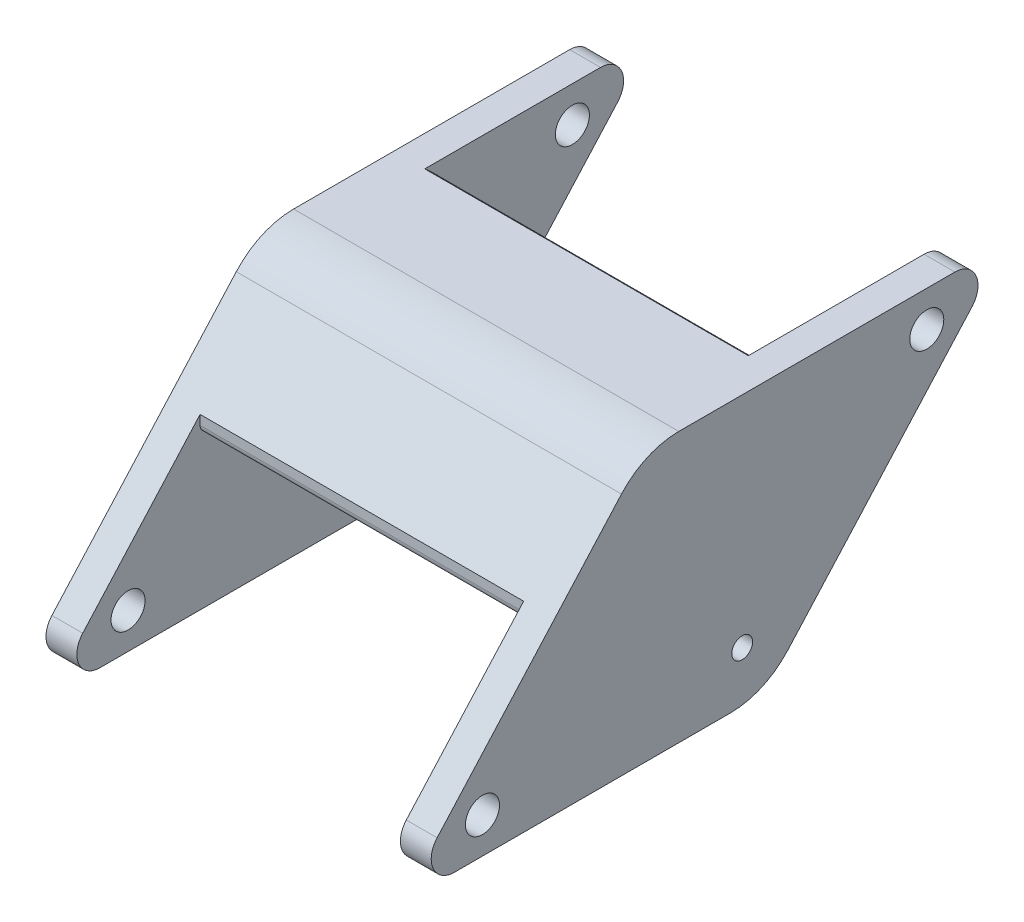
ISO-10303-21;
HEADER;
FILE_DESCRIPTION(('STEP AP214'),'2;1');
FILE_NAME('part.step','',(''),(''),'','','');
FILE_SCHEMA(('AUTOMOTIVE_DESIGN { 1 0 10303 214 1 1 1 1 }'));
ENDSEC;
DATA;
#1=APPLICATION_CONTEXT('core data for automotive mechanical design processes');
#2=APPLICATION_PROTOCOL_DEFINITION('international standard','automotive_design',2000,#1);
#3=PRODUCT_CONTEXT('',#1,'mechanical');
#4=PRODUCT('Part','Part','',(#3));
#5=PRODUCT_RELATED_PRODUCT_CATEGORY('part','',(#4));
#6=PRODUCT_DEFINITION_FORMATION('','',#4);
#7=PRODUCT_DEFINITION_CONTEXT('part definition',#1,'design');
#8=PRODUCT_DEFINITION('design','',#6,#7);
#9=PRODUCT_DEFINITION_SHAPE('','',#8);
#10=(LENGTH_UNIT() NAMED_UNIT(*) SI_UNIT(.MILLI.,.METRE.));
#11=(NAMED_UNIT(*) PLANE_ANGLE_UNIT() SI_UNIT($,.RADIAN.));
#12=(NAMED_UNIT(*) SI_UNIT($,.STERADIAN.) SOLID_ANGLE_UNIT());
#13=UNCERTAINTY_MEASURE_WITH_UNIT(LENGTH_MEASURE(1.E-05),#10,'distance_accuracy_value','');
#14=(GEOMETRIC_REPRESENTATION_CONTEXT(3) GLOBAL_UNCERTAINTY_ASSIGNED_CONTEXT((#13)) GLOBAL_UNIT_ASSIGNED_CONTEXT((#10,
#11,#12)) REPRESENTATION_CONTEXT('',''));
#15=CARTESIAN_POINT('',(0.,0.,0.));
#16=DIRECTION('',(0.,0.,1.));
#17=DIRECTION('',(1.,0.,0.));
#18=AXIS2_PLACEMENT_3D('',#15,#16,#17);
#19=CARTESIAN_POINT('',(4.,11.5468785027384,-24.0553453618104));
#20=DIRECTION('',(0.,0.66777921611463,0.744359401448877));
#21=DIRECTION('',(0.,-0.744359401448877,0.66777921611463));
#22=AXIS2_PLACEMENT_3D('',#19,#20,#21);
#23=PLANE('',#22);
#24=DIRECTION('',(0.,0.744359401448877,-0.66777921611463));
#25=VECTOR('',#24,1.);
#26=CARTESIAN_POINT('',(46.,-6.80804717172648,-7.58878652628227));
#27=LINE('',#26,#25);
#28=CARTESIAN_POINT('',(46.,-15.127576010064,-0.125176292712019));
#29=VERTEX_POINT('',#28);
#30=CARTESIAN_POINT('',(46.,11.5468785027384,-24.0553453618104));
#31=VERTEX_POINT('',#30);
#32=EDGE_CURVE('E256',#29,#31,#27,.T.);
#33=ORIENTED_EDGE('',*,*,#32,.T.);
#34=DIRECTION('',(-1.,0.,0.));
#35=VECTOR('',#34,1.);
#36=CARTESIAN_POINT('',(4.,11.5468785027384,-24.0553453618104));
#37=LINE('',#36,#35);
#38=CARTESIAN_POINT('',(50.,11.5468785027384,-24.0553453618104));
#39=VERTEX_POINT('',#38);
#40=EDGE_CURVE('E323',#39,#31,#37,.T.);
#41=ORIENTED_EDGE('',*,*,#40,.F.);
#42=DIRECTION('',(0.,0.744359401448877,-0.66777921611463));
#43=VECTOR('',#42,1.);
#44=CARTESIAN_POINT('',(50.,-6.80804717172648,-7.58878652628227));
#45=LINE('',#44,#43);
#46=CARTESIAN_POINT('',(50.,-15.127576010064,-0.125176292712019));
#47=VERTEX_POINT('',#46);
#48=EDGE_CURVE('E231',#47,#39,#45,.T.);
#49=ORIENTED_EDGE('',*,*,#48,.F.);
#50=DIRECTION('',(-1.,0.,0.));
#51=VECTOR('',#50,1.);
#52=CARTESIAN_POINT('',(50.,-15.127576010064,-0.125176292712019));
#53=LINE('',#52,#51);
#54=EDGE_CURVE('E261',#47,#29,#53,.T.);
#55=ORIENTED_EDGE('',*,*,#54,.T.);
#56=EDGE_LOOP('',(#33,#41,#49,#55));
#57=FACE_BOUND('',#56,.T.);
#58=ADVANCED_FACE('F35',(#57),#23,.F.);
#59=CARTESIAN_POINT('',(4.,13.5502161510823,-21.8222671574638));
#60=DIRECTION('',(-1.,0.,0.));
#61=DIRECTION('',(0.,0.,1.));
#62=AXIS2_PLACEMENT_3D('',#59,#60,#61);
#63=CYLINDRICAL_SURFACE('',#62,3.);
#64=CARTESIAN_POINT('',(46.,13.5502161510823,-21.8222671574638));
#65=DIRECTION('',(-1.,0.,0.));
#66=DIRECTION('',(0.,0.,1.));
#67=AXIS2_PLACEMENT_3D('',#64,#65,#66);
#68=CIRCLE('',#67,3.);
#69=CARTESIAN_POINT('',(46.,16.5502161510823,-21.8222671574638));
#70=VERTEX_POINT('',#69);
#71=EDGE_CURVE('E187',#70,#31,#68,.T.);
#72=ORIENTED_EDGE('',*,*,#71,.F.);
#73=DIRECTION('',(-1.,0.,0.));
#74=VECTOR('',#73,1.);
#75=CARTESIAN_POINT('',(4.,16.5502161510823,-21.8222671574638));
#76=LINE('',#75,#74);
#77=CARTESIAN_POINT('',(50.,16.5502161510823,-21.8222671574638));
#78=VERTEX_POINT('',#77);
#79=EDGE_CURVE('E320',#78,#70,#76,.T.);
#80=ORIENTED_EDGE('',*,*,#79,.F.);
#81=CARTESIAN_POINT('',(50.,13.5502161510823,-21.8222671574638));
#82=DIRECTION('',(1.,0.,0.));
#83=DIRECTION('',(0.,0.,-1.));
#84=AXIS2_PLACEMENT_3D('',#81,#82,#83);
#85=CIRCLE('',#84,3.);
#86=EDGE_CURVE('E235',#39,#78,#85,.T.);
#87=ORIENTED_EDGE('',*,*,#86,.F.);
#88=ORIENTED_EDGE('',*,*,#40,.T.);
#89=EDGE_LOOP('',(#72,#80,#87,#88));
#90=FACE_BOUND('',#89,.T.);
#91=ADVANCED_FACE('F371',(#90),#63,.T.);
#92=CARTESIAN_POINT('',(4.,-15.4497838489177,43.1538682593548));
#93=DIRECTION('',(-1.,0.,0.));
#94=DIRECTION('',(0.,0.,1.));
#95=AXIS2_PLACEMENT_3D('',#92,#93,#94);
#96=CYLINDRICAL_SURFACE('',#95,3.);
#97=CARTESIAN_POINT('',(46.,-15.4497838489177,43.1538682593548));
#98=DIRECTION('',(1.,0.,0.));
#99=DIRECTION('',(0.,0.,-1.));
#100=AXIS2_PLACEMENT_3D('',#97,#98,#99);
#101=CIRCLE('',#100,3.);
#102=CARTESIAN_POINT('',(46.,-13.4464462005738,45.3869464637014));
#103=VERTEX_POINT('',#102);
#104=CARTESIAN_POINT('',(46.,-18.4497838489177,43.1538682593548));
#105=VERTEX_POINT('',#104);
#106=EDGE_CURVE('E203',#103,#105,#101,.T.);
#107=ORIENTED_EDGE('',*,*,#106,.T.);
#108=DIRECTION('',(-1.,0.,0.));
#109=VECTOR('',#108,1.);
#110=CARTESIAN_POINT('',(4.,-18.4497838489177,43.1538682593548));
#111=LINE('',#110,#109);
#112=CARTESIAN_POINT('',(50.,-18.4497838489177,43.1538682593548));
#113=VERTEX_POINT('',#112);
#114=EDGE_CURVE('E306',#113,#105,#111,.T.);
#115=ORIENTED_EDGE('',*,*,#114,.F.);
#116=CARTESIAN_POINT('',(50.,-15.4497838489177,43.1538682593548));
#117=DIRECTION('',(1.,0.,0.));
#118=DIRECTION('',(0.,0.,-1.));
#119=AXIS2_PLACEMENT_3D('',#116,#117,#118);
#120=CIRCLE('',#119,3.);
#121=CARTESIAN_POINT('',(50.,-13.4464462005738,45.3869464637014));
#122=VERTEX_POINT('',#121);
#123=EDGE_CURVE('E247',#122,#113,#120,.T.);
#124=ORIENTED_EDGE('',*,*,#123,.F.);
#125=DIRECTION('',(-1.,0.,0.));
#126=VECTOR('',#125,1.);
#127=CARTESIAN_POINT('',(4.,-13.4464462005738,45.3869464637014));
#128=LINE('',#127,#126);
#129=EDGE_CURVE('E310',#122,#103,#128,.T.);
#130=ORIENTED_EDGE('',*,*,#129,.T.);
#131=EDGE_LOOP('',(#107,#115,#124,#130));
#132=FACE_BOUND('',#131,.T.);
#133=ADVANCED_FACE('F378',(#132),#96,.T.);
#134=CARTESIAN_POINT('',(4.,-18.4497838489177,43.1538682593548));
#135=DIRECTION('',(0.,1.,0.));
#136=DIRECTION('',(0.,0.,1.));
#137=AXIS2_PLACEMENT_3D('',#134,#135,#136);
#138=PLANE('',#137);
#139=DIRECTION('',(0.,0.,-1.));
#140=VECTOR('',#139,1.);
#141=CARTESIAN_POINT('',(4.,-18.4497838489177,43.1538682593548));
#142=LINE('',#141,#140);
#143=CARTESIAN_POINT('',(4.00000000000001,-18.4497838489177,43.1538682593548));
#144=VERTEX_POINT('',#143);
#145=CARTESIAN_POINT('',(4.,-18.4497838489177,7.31841772177682));
#146=VERTEX_POINT('',#145);
#147=EDGE_CURVE('E281',#144,#146,#142,.T.);
#148=ORIENTED_EDGE('',*,*,#147,.F.);
#149=CARTESIAN_POINT('',(0.,-18.4497838489177,43.1538682593548));
#150=VERTEX_POINT('',#149);
#151=EDGE_CURVE('E305',#144,#150,#111,.T.);
#152=ORIENTED_EDGE('',*,*,#151,.T.);
#153=DIRECTION('',(0.,0.,-1.));
#154=VECTOR('',#153,1.);
#155=CARTESIAN_POINT('',(0.,-18.4497838489177,43.1538682593548));
#156=LINE('',#155,#154);
#157=CARTESIAN_POINT('',(0.,-18.4497838489177,7.31841772177682));
#158=VERTEX_POINT('',#157);
#159=EDGE_CURVE('E279',#150,#158,#156,.T.);
#160=ORIENTED_EDGE('',*,*,#159,.T.);
#161=DIRECTION('',(-1.,0.,0.));
#162=VECTOR('',#161,1.);
#163=CARTESIAN_POINT('',(4.,-18.4497838489177,7.31841772177682));
#164=LINE('',#163,#162);
#165=EDGE_CURVE('E283',#146,#158,#164,.T.);
#166=ORIENTED_EDGE('',*,*,#165,.F.);
#167=EDGE_LOOP('',(#148,#152,#160,#166));
#168=FACE_BOUND('',#167,.T.);
#169=ADVANCED_FACE('F428',(#168),#138,.F.);
#170=CARTESIAN_POINT('',(46.,0.,0.));
#171=DIRECTION('',(1.,0.,0.));
#172=DIRECTION('',(0.,0.,-1.));
#173=AXIS2_PLACEMENT_3D('',#170,#171,#172);
#174=PLANE('',#173);
#175=CARTESIAN_POINT('',(46.,-13.8195181432474,39.5011660091139));
#176=DIRECTION('',(1.,0.,0.));
#177=DIRECTION('',(0.,0.,-1.));
#178=AXIS2_PLACEMENT_3D('',#175,#176,#177);
#179=CIRCLE('',#178,2.21);
#180=CARTESIAN_POINT('',(46.,-13.8195181432474,37.2911660091139));
#181=VERTEX_POINT('',#180);
#182=EDGE_CURVE('E177',#181,#181,#179,.T.);
#183=ORIENTED_EDGE('',*,*,#182,.T.);
#184=EDGE_LOOP('',(#183));
#185=FACE_BOUND('',#184,.T.);
#186=CARTESIAN_POINT('',(46.,11.9199504454126,-18.1695649072226));
#187=DIRECTION('',(1.,0.,0.));
#188=DIRECTION('',(0.,0.,-1.));
#189=AXIS2_PLACEMENT_3D('',#186,#187,#188);
#190=CIRCLE('',#189,2.21);
#191=CARTESIAN_POINT('',(46.,11.9199504454126,-20.3795649072226));
#192=VERTEX_POINT('',#191);
#193=EDGE_CURVE('E510',#192,#192,#190,.T.);
#194=ORIENTED_EDGE('',*,*,#193,.T.);
#195=EDGE_LOOP('',(#194));
#196=FACE_BOUND('',#195,.T.);
#197=DIRECTION('',(0.,1.,0.));
#198=VECTOR('',#197,1.);
#199=CARTESIAN_POINT('',(46.,-18.4497838489177,30.1538682593548));
#200=LINE('',#199,#198);
#201=CARTESIAN_POINT('',(46.,2.29949484999777,30.1538682593548));
#202=VERTEX_POINT('',#201);
#203=CARTESIAN_POINT('',(46.,3.53354464188598,30.1538682593548));
#204=VERTEX_POINT('',#203);
#205=EDGE_CURVE('E200',#202,#204,#200,.T.);
#206=ORIENTED_EDGE('',*,*,#205,.F.);
#207=CARTESIAN_POINT('',(46.,2.29949484999777,29.1538682593548));
#208=DIRECTION('',(1.,0.,0.));
#209=DIRECTION('',(0.,0.,-1.));
#210=AXIS2_PLACEMENT_3D('',#207,#208,#209);
#211=CIRCLE('',#210,1.);
#212=CARTESIAN_POINT('',(46.,1.7880396434308,28.2945583201155));
#213=VERTEX_POINT('',#212);
#214=EDGE_CURVE('E339',#202,#213,#211,.T.);
#215=ORIENTED_EDGE('',*,*,#214,.T.);
#216=CARTESIAN_POINT('',(46.,-11.5096495734594,5.95274545699105));
#217=DIRECTION('',(-1.,0.,0.));
#218=DIRECTION('',(0.,0.,1.));
#219=AXIS2_PLACEMENT_3D('',#216,#217,#218);
#220=CIRCLE('',#219,25.9997142391964);
#221=CARTESIAN_POINT('',(46.,14.0006093580096,0.931607162811683));
#222=VERTEX_POINT('',#221);
#223=EDGE_CURVE('E264',#213,#222,#220,.T.);
#224=ORIENTED_EDGE('',*,*,#223,.T.);
#225=CARTESIAN_POINT('',(46.,14.9817839469599,0.738484336615015));
#226=DIRECTION('',(1.,0.,0.));
#227=DIRECTION('',(0.,0.,-1.));
#228=AXIS2_PLACEMENT_3D('',#225,#226,#227);
#229=CIRCLE('',#228,1.);
#230=CARTESIAN_POINT('',(46.,15.7261433484088,0.0707051205003743));
#231=VERTEX_POINT('',#230);
#232=EDGE_CURVE('E43',#222,#231,#229,.T.);
#233=ORIENTED_EDGE('',*,*,#232,.T.);
#234=DIRECTION('',(0.,0.66777921611463,0.744359401448877));
#235=VECTOR('',#234,1.);
#236=CARTESIAN_POINT('',(46.,-11.8873898877638,-30.7095177069764));
#237=LINE('',#236,#235);
#238=CARTESIAN_POINT('',(46.,16.5502161510823,0.989281684948384));
#239=VERTEX_POINT('',#238);
#240=EDGE_CURVE('E176',#231,#239,#237,.T.);
#241=ORIENTED_EDGE('',*,*,#240,.T.);
#242=DIRECTION('',(0.,0.,-1.));
#243=VECTOR('',#242,1.);
#244=CARTESIAN_POINT('',(46.,16.5502161510823,14.0131833801142));
#245=LINE('',#244,#243);
#246=EDGE_CURVE('E192',#239,#70,#245,.T.);
#247=ORIENTED_EDGE('',*,*,#246,.T.);
#248=ORIENTED_EDGE('',*,*,#71,.T.);
#249=ORIENTED_EDGE('',*,*,#32,.F.);
#250=CARTESIAN_POINT('',(46.,-8.44978384891769,7.31841772177678));
#251=DIRECTION('',(1.,0.,0.));
#252=DIRECTION('',(0.,0.,-1.));
#253=AXIS2_PLACEMENT_3D('',#250,#251,#252);
#254=CIRCLE('',#253,10.);
#255=CARTESIAN_POINT('',(46.,-18.4497838489177,7.31841772177667));
#256=VERTEX_POINT('',#255);
#257=EDGE_CURVE('E227',#29,#256,#254,.F.);
#258=ORIENTED_EDGE('',*,*,#257,.T.);
#259=DIRECTION('',(0.,0.,1.));
#260=VECTOR('',#259,1.);
#261=CARTESIAN_POINT('',(46.,-18.4497838489177,0.));
#262=LINE('',#261,#260);
#263=EDGE_CURVE('E232',#256,#105,#262,.T.);
#264=ORIENTED_EDGE('',*,*,#263,.T.);
#265=ORIENTED_EDGE('',*,*,#106,.F.);
#266=DIRECTION('',(0.,-0.744359401448877,0.66777921611463));
#267=VECTOR('',#266,1.);
#268=CARTESIAN_POINT('',(46.,13.2280083122286,21.456777394603));
#269=LINE('',#268,#267);
#270=EDGE_CURVE('E206',#204,#103,#269,.T.);
#271=ORIENTED_EDGE('',*,*,#270,.F.);
#272=EDGE_LOOP('',(#206,#215,#224,#233,#241,#247,#248,#249,#258,#264,#265,#271));
#273=FACE_BOUND('',#272,.T.);
#274=CARTESIAN_POINT('',(46.,-11.8749197984836,5.78971888642409));
#275=DIRECTION('',(1.,0.,0.));
#276=DIRECTION('',(0.,0.,-1.));
#277=AXIS2_PLACEMENT_3D('',#274,#275,#276);
#278=CIRCLE('',#277,3.);
#279=CARTESIAN_POINT('',(46.,-11.8749197984836,2.78971888642409));
#280=VERTEX_POINT('',#279);
#281=EDGE_CURVE('E329',#280,#280,#278,.F.);
#282=ORIENTED_EDGE('',*,*,#281,.F.);
#283=EDGE_LOOP('',(#282));
#284=FACE_BOUND('',#283,.T.);
#285=ADVANCED_FACE('F352',(#185,#196,#273,#284),#174,.F.);
#286=CARTESIAN_POINT('',(4.,-8.44978384891769,7.31841772177678));
#287=DIRECTION('',(1.,0.,0.));
#288=DIRECTION('',(0.,0.,-1.));
#289=AXIS2_PLACEMENT_3D('',#286,#287,#288);
#290=PLANE('',#289);
#291=CARTESIAN_POINT('',(4.,-13.8195181432474,39.5011660091139));
#292=DIRECTION('',(1.,0.,0.));
#293=DIRECTION('',(0.,0.,-1.));
#294=AXIS2_PLACEMENT_3D('',#291,#292,#293);
#295=CIRCLE('',#294,2.21);
#296=CARTESIAN_POINT('',(4.,-13.8195181432474,37.2911660091139));
#297=VERTEX_POINT('',#296);
#298=EDGE_CURVE('E513',#297,#297,#295,.T.);
#299=ORIENTED_EDGE('',*,*,#298,.F.);
#300=EDGE_LOOP('',(#299));
#301=FACE_BOUND('',#300,.T.);
#302=CARTESIAN_POINT('',(4.,11.9199504454126,-18.1695649072226));
#303=DIRECTION('',(1.,0.,0.));
#304=DIRECTION('',(0.,0.,-1.));
#305=AXIS2_PLACEMENT_3D('',#302,#303,#304);
#306=CIRCLE('',#305,2.21);
#307=CARTESIAN_POINT('',(4.,11.9199504454126,-20.3795649072226));
#308=VERTEX_POINT('',#307);
#309=EDGE_CURVE('E507',#308,#308,#306,.T.);
#310=ORIENTED_EDGE('',*,*,#309,.F.);
#311=EDGE_LOOP('',(#310));
#312=FACE_BOUND('',#311,.T.);
#313=DIRECTION('',(0.,0.744359401448877,-0.66777921611463));
#314=VECTOR('',#313,1.);
#315=CARTESIAN_POINT('',(4.,11.5468785027384,-24.0553453618104));
#316=LINE('',#315,#314);
#317=CARTESIAN_POINT('',(4.,-15.127576010064,-0.125176292712019));
#318=VERTEX_POINT('',#317);
#319=CARTESIAN_POINT('',(4.,11.5468785027384,-24.0553453618104));
#320=VERTEX_POINT('',#319);
#321=EDGE_CURVE('E278',#318,#320,#316,.T.);
#322=ORIENTED_EDGE('',*,*,#321,.T.);
#323=CARTESIAN_POINT('',(4.,13.5502161510823,-21.8222671574638));
#324=DIRECTION('',(-1.,0.,0.));
#325=DIRECTION('',(0.,-1.,0.));
#326=AXIS2_PLACEMENT_3D('',#323,#324,#325);
#327=CIRCLE('',#326,3.);
#328=CARTESIAN_POINT('',(4.,16.5502161510823,-21.8222671574638));
#329=VERTEX_POINT('',#328);
#330=EDGE_CURVE('E184',#329,#320,#327,.T.);
#331=ORIENTED_EDGE('',*,*,#330,.F.);
#332=DIRECTION('',(0.,0.,-1.));
#333=VECTOR('',#332,1.);
#334=CARTESIAN_POINT('',(4.,16.5502161510823,14.0131833801142));
#335=LINE('',#334,#333);
#336=CARTESIAN_POINT('',(4.,16.5502161510823,0.989281684948384));
#337=VERTEX_POINT('',#336);
#338=EDGE_CURVE('E180',#337,#329,#335,.T.);
#339=ORIENTED_EDGE('',*,*,#338,.F.);
#340=DIRECTION('',(0.,0.66777921611463,0.744359401448877));
#341=VECTOR('',#340,1.);
#342=CARTESIAN_POINT('',(4.,-11.8873898877638,-30.7095177069764));
#343=LINE('',#342,#341);
#344=CARTESIAN_POINT('',(4.,15.7261433484088,0.0707051205003743));
#345=VERTEX_POINT('',#344);
#346=EDGE_CURVE('E168',#345,#337,#343,.T.);
#347=ORIENTED_EDGE('',*,*,#346,.F.);
#348=CARTESIAN_POINT('',(4.,14.9817839469599,0.738484336615015));
#349=DIRECTION('',(1.,0.,0.));
#350=DIRECTION('',(0.,0.,-1.));
#351=AXIS2_PLACEMENT_3D('',#348,#349,#350);
#352=CIRCLE('',#351,1.);
#353=CARTESIAN_POINT('',(4.,14.0006093580096,0.931607162811683));
#354=VERTEX_POINT('',#353);
#355=EDGE_CURVE('E11',#345,#354,#352,.F.);
#356=ORIENTED_EDGE('',*,*,#355,.T.);
#357=CARTESIAN_POINT('',(4.,-11.5096495734594,5.95274545699105));
#358=DIRECTION('',(-1.,0.,0.));
#359=DIRECTION('',(0.,0.,1.));
#360=AXIS2_PLACEMENT_3D('',#357,#358,#359);
#361=CIRCLE('',#360,25.9997142391964);
#362=CARTESIAN_POINT('',(4.,1.7880396434308,28.2945583201155));
#363=VERTEX_POINT('',#362);
#364=EDGE_CURVE('E263',#363,#354,#361,.T.);
#365=ORIENTED_EDGE('',*,*,#364,.F.);
#366=CARTESIAN_POINT('',(4.,2.29949484999777,29.1538682593548));
#367=DIRECTION('',(1.,0.,0.));
#368=DIRECTION('',(0.,0.,-1.));
#369=AXIS2_PLACEMENT_3D('',#366,#367,#368);
#370=CIRCLE('',#369,1.);
#371=CARTESIAN_POINT('',(4.00000000000001,2.29949484999777,30.1538682593548));
#372=VERTEX_POINT('',#371);
#373=EDGE_CURVE('E337',#363,#372,#370,.F.);
#374=ORIENTED_EDGE('',*,*,#373,.T.);
#375=DIRECTION('',(0.,1.,0.));
#376=VECTOR('',#375,1.);
#377=CARTESIAN_POINT('',(4.00000000000001,-18.4497838489177,30.1538682593548));
#378=LINE('',#377,#376);
#379=CARTESIAN_POINT('',(4.00000000000001,3.53354464188597,30.1538682593548));
#380=VERTEX_POINT('',#379);
#381=EDGE_CURVE('E201',#372,#380,#378,.T.);
#382=ORIENTED_EDGE('',*,*,#381,.T.);
#383=DIRECTION('',(0.,0.744359401448877,-0.66777921611463));
#384=VECTOR('',#383,1.);
#385=CARTESIAN_POINT('',(4.,13.2280083122286,21.456777394603));
#386=LINE('',#385,#384);
#387=CARTESIAN_POINT('',(4.00000000000001,-13.4464462005738,45.3869464637014));
#388=VERTEX_POINT('',#387);
#389=EDGE_CURVE('E215',#388,#380,#386,.T.);
#390=ORIENTED_EDGE('',*,*,#389,.F.);
#391=CARTESIAN_POINT('',(4.00000000000001,-15.4497838489177,43.1538682593548));
#392=DIRECTION('',(-1.,0.,0.));
#393=DIRECTION('',(0.,0.,1.));
#394=AXIS2_PLACEMENT_3D('',#391,#392,#393);
#395=CIRCLE('',#394,3.);
#396=EDGE_CURVE('E212',#144,#388,#395,.T.);
#397=ORIENTED_EDGE('',*,*,#396,.F.);
#398=ORIENTED_EDGE('',*,*,#147,.T.);
#399=CARTESIAN_POINT('',(4.,-8.44978384891769,7.31841772177678));
#400=DIRECTION('',(1.,0.,0.));
#401=DIRECTION('',(0.,0.,-1.));
#402=AXIS2_PLACEMENT_3D('',#399,#400,#401);
#403=CIRCLE('',#402,10.);
#404=EDGE_CURVE('E275',#146,#318,#403,.T.);
#405=ORIENTED_EDGE('',*,*,#404,.T.);
#406=EDGE_LOOP('',(#322,#331,#339,#347,#356,#365,#374,#382,#390,#397,#398,#405));
#407=FACE_BOUND('',#406,.T.);
#408=CARTESIAN_POINT('',(4.,-11.5096495734594,5.95274545699105));
#409=DIRECTION('',(1.,0.,0.));
#410=DIRECTION('',(0.,0.,-1.));
#411=AXIS2_PLACEMENT_3D('',#408,#409,#410);
#412=CIRCLE('',#411,3.6);
#413=CARTESIAN_POINT('',(4.,-11.5096495734594,2.35274545699105));
#414=VERTEX_POINT('',#413);
#415=EDGE_CURVE('E269',#414,#414,#412,.T.);
#416=ORIENTED_EDGE('',*,*,#415,.F.);
#417=EDGE_LOOP('',(#416));
#418=FACE_BOUND('',#417,.T.);
#419=ADVANCED_FACE('F181',(#301,#312,#407,#418),#290,.T.);
#420=CARTESIAN_POINT('',(0.,-8.44978384891769,7.31841772177678));
#421=DIRECTION('',(1.,0.,0.));
#422=DIRECTION('',(0.,0.,-1.));
#423=AXIS2_PLACEMENT_3D('',#420,#421,#422);
#424=PLANE('',#423);
#425=CARTESIAN_POINT('',(0.,-13.8195181432474,39.5011660091139));
#426=DIRECTION('',(1.,0.,0.));
#427=DIRECTION('',(0.,0.,-1.));
#428=AXIS2_PLACEMENT_3D('',#425,#426,#427);
#429=CIRCLE('',#428,2.21);
#430=CARTESIAN_POINT('',(0.,-13.8195181432474,37.2911660091139));
#431=VERTEX_POINT('',#430);
#432=EDGE_CURVE('E493',#431,#431,#429,.T.);
#433=ORIENTED_EDGE('',*,*,#432,.T.);
#434=EDGE_LOOP('',(#433));
#435=FACE_BOUND('',#434,.T.);
#436=CARTESIAN_POINT('',(0.,11.9199504454126,-18.1695649072226));
#437=DIRECTION('',(1.,0.,0.));
#438=DIRECTION('',(0.,0.,-1.));
#439=AXIS2_PLACEMENT_3D('',#436,#437,#438);
#440=CIRCLE('',#439,2.21);
#441=CARTESIAN_POINT('',(0.,11.9199504454126,-20.3795649072226));
#442=VERTEX_POINT('',#441);
#443=EDGE_CURVE('E496',#442,#442,#440,.T.);
#444=ORIENTED_EDGE('',*,*,#443,.T.);
#445=EDGE_LOOP('',(#444));
#446=FACE_BOUND('',#445,.T.);
#447=CARTESIAN_POINT('',(0.,-8.44978384891769,7.31841772177678));
#448=DIRECTION('',(1.,0.,0.));
#449=DIRECTION('',(0.,0.,-1.));
#450=AXIS2_PLACEMENT_3D('',#447,#448,#449);
#451=CIRCLE('',#450,10.);
#452=CARTESIAN_POINT('',(0.,-15.127576010064,-0.125176292712019));
#453=VERTEX_POINT('',#452);
#454=EDGE_CURVE('E272',#158,#453,#451,.T.);
#455=ORIENTED_EDGE('',*,*,#454,.F.);
#456=ORIENTED_EDGE('',*,*,#159,.F.);
#457=CARTESIAN_POINT('',(0.,-15.4497838489177,43.1538682593548));
#458=DIRECTION('',(1.,0.,0.));
#459=DIRECTION('',(0.,0.,-1.));
#460=AXIS2_PLACEMENT_3D('',#457,#458,#459);
#461=CIRCLE('',#460,3.);
#462=CARTESIAN_POINT('',(0.,-13.4464462005738,45.3869464637014));
#463=VERTEX_POINT('',#462);
#464=EDGE_CURVE('E299',#463,#150,#461,.T.);
#465=ORIENTED_EDGE('',*,*,#464,.F.);
#466=DIRECTION('',(0.,-0.744359401448877,0.66777921611463));
#467=VECTOR('',#466,1.);
#468=CARTESIAN_POINT('',(0.,13.2280083122286,21.456777394603));
#469=LINE('',#468,#467);
#470=CARTESIAN_POINT('',(0.,13.2280083122286,21.456777394603));
#471=VERTEX_POINT('',#470);
#472=EDGE_CURVE('E296',#471,#463,#469,.T.);
#473=ORIENTED_EDGE('',*,*,#472,.F.);
#474=CARTESIAN_POINT('',(0.,6.55021615108231,14.0131833801142));
#475=DIRECTION('',(1.,0.,0.));
#476=DIRECTION('',(0.,0.,1.));
#477=AXIS2_PLACEMENT_3D('',#474,#475,#476);
#478=CIRCLE('',#477,10.);
#479=CARTESIAN_POINT('',(0.,16.5502161510823,14.0131833801142));
#480=VERTEX_POINT('',#479);
#481=EDGE_CURVE('E294',#480,#471,#478,.T.);
#482=ORIENTED_EDGE('',*,*,#481,.F.);
#483=DIRECTION('',(0.,0.,1.));
#484=VECTOR('',#483,1.);
#485=CARTESIAN_POINT('',(0.,16.5502161510823,14.0131833801142));
#486=LINE('',#485,#484);
#487=CARTESIAN_POINT('',(0.,16.5502161510823,-21.8222671574638));
#488=VERTEX_POINT('',#487);
#489=EDGE_CURVE('E292',#488,#480,#486,.T.);
#490=ORIENTED_EDGE('',*,*,#489,.F.);
#491=CARTESIAN_POINT('',(0.,13.5502161510823,-21.8222671574638));
#492=DIRECTION('',(1.,0.,0.));
#493=DIRECTION('',(0.,0.,-1.));
#494=AXIS2_PLACEMENT_3D('',#491,#492,#493);
#495=CIRCLE('',#494,3.);
#496=CARTESIAN_POINT('',(0.,11.5468785027384,-24.0553453618104));
#497=VERTEX_POINT('',#496);
#498=EDGE_CURVE('E289',#497,#488,#495,.T.);
#499=ORIENTED_EDGE('',*,*,#498,.F.);
#500=DIRECTION('',(0.,0.744359401448877,-0.66777921611463));
#501=VECTOR('',#500,1.);
#502=CARTESIAN_POINT('',(0.,11.5468785027384,-24.0553453618104));
#503=LINE('',#502,#501);
#504=EDGE_CURVE('E286',#453,#497,#503,.T.);
#505=ORIENTED_EDGE('',*,*,#504,.F.);
#506=EDGE_LOOP('',(#455,#456,#465,#473,#482,#490,#499,#505));
#507=FACE_BOUND('',#506,.T.);
#508=CARTESIAN_POINT('',(0.,-11.5096495734594,5.95274545699105));
#509=DIRECTION('',(1.,0.,0.));
#510=DIRECTION('',(0.,0.,-1.));
#511=AXIS2_PLACEMENT_3D('',#508,#509,#510);
#512=CIRCLE('',#511,3.6);
#513=CARTESIAN_POINT('',(0.,-11.5096495734594,2.35274545699105));
#514=VERTEX_POINT('',#513);
#515=EDGE_CURVE('E266',#514,#514,#512,.T.);
#516=ORIENTED_EDGE('',*,*,#515,.T.);
#517=EDGE_LOOP('',(#516));
#518=FACE_BOUND('',#517,.T.);
#519=ADVANCED_FACE('F391',(#435,#446,#507,#518),#424,.F.);
#520=CARTESIAN_POINT('',(4.,-8.44978384891769,7.31841772177678));
#521=DIRECTION('',(-1.,0.,0.));
#522=DIRECTION('',(0.,0.,1.));
#523=AXIS2_PLACEMENT_3D('',#520,#521,#522);
#524=CYLINDRICAL_SURFACE('',#523,10.);
#525=ORIENTED_EDGE('',*,*,#454,.T.);
#526=DIRECTION('',(-1.,0.,0.));
#527=VECTOR('',#526,1.);
#528=CARTESIAN_POINT('',(4.,-15.127576010064,-0.125176292712019));
#529=LINE('',#528,#527);
#530=EDGE_CURVE('E326',#318,#453,#529,.T.);
#531=ORIENTED_EDGE('',*,*,#530,.F.);
#532=ORIENTED_EDGE('',*,*,#404,.F.);
#533=ORIENTED_EDGE('',*,*,#165,.T.);
#534=EDGE_LOOP('',(#525,#531,#532,#533));
#535=FACE_BOUND('',#534,.T.);
#536=ADVANCED_FACE('F384',(#535),#524,.T.);
#537=EDGE_CURVE('E322',#320,#497,#37,.T.);
#538=ORIENTED_EDGE('',*,*,#537,.F.);
#539=ORIENTED_EDGE('',*,*,#321,.F.);
#540=ORIENTED_EDGE('',*,*,#530,.T.);
#541=ORIENTED_EDGE('',*,*,#504,.T.);
#542=EDGE_LOOP('',(#538,#539,#540,#541));
#543=FACE_BOUND('',#542,.T.);
#544=ADVANCED_FACE('F374',(#543),#23,.F.);
#545=EDGE_CURVE('E319',#329,#488,#76,.T.);
#546=ORIENTED_EDGE('',*,*,#545,.F.);
#547=ORIENTED_EDGE('',*,*,#330,.T.);
#548=ORIENTED_EDGE('',*,*,#537,.T.);
#549=ORIENTED_EDGE('',*,*,#498,.T.);
#550=EDGE_LOOP('',(#546,#547,#548,#549));
#551=FACE_BOUND('',#550,.T.);
#552=ADVANCED_FACE('F381',(#551),#63,.T.);
#553=CARTESIAN_POINT('',(4.,16.5502161510823,14.0131833801142));
#554=DIRECTION('',(0.,-1.,0.));
#555=DIRECTION('',(0.,0.,-1.));
#556=AXIS2_PLACEMENT_3D('',#553,#554,#555);
#557=PLANE('',#556);
#558=DIRECTION('',(-1.,0.,0.));
#559=VECTOR('',#558,1.);
#560=CARTESIAN_POINT('',(4.,16.5502161510823,0.98928168494839));
#561=LINE('',#560,#559);
#562=EDGE_CURVE('E172',#239,#337,#561,.T.);
#563=ORIENTED_EDGE('',*,*,#562,.T.);
#564=ORIENTED_EDGE('',*,*,#338,.T.);
#565=ORIENTED_EDGE('',*,*,#545,.T.);
#566=ORIENTED_EDGE('',*,*,#489,.T.);
#567=DIRECTION('',(-1.,0.,0.));
#568=VECTOR('',#567,1.);
#569=CARTESIAN_POINT('',(4.,16.5502161510823,14.0131833801142));
#570=LINE('',#569,#568);
#571=CARTESIAN_POINT('',(50.,16.5502161510823,14.0131833801142));
#572=VERTEX_POINT('',#571);
#573=EDGE_CURVE('E316',#572,#480,#570,.T.);
#574=ORIENTED_EDGE('',*,*,#573,.F.);
#575=DIRECTION('',(0.,0.,1.));
#576=VECTOR('',#575,1.);
#577=CARTESIAN_POINT('',(50.,16.5502161510823,0.));
#578=LINE('',#577,#576);
#579=EDGE_CURVE('E238',#78,#572,#578,.T.);
#580=ORIENTED_EDGE('',*,*,#579,.F.);
#581=ORIENTED_EDGE('',*,*,#79,.T.);
#582=ORIENTED_EDGE('',*,*,#246,.F.);
#583=EDGE_LOOP('',(#563,#564,#565,#566,#574,#580,#581,#582));
#584=FACE_BOUND('',#583,.T.);
#585=ADVANCED_FACE('F189',(#584),#557,.F.);
#586=CARTESIAN_POINT('',(4.,6.55021615108231,14.0131833801142));
#587=DIRECTION('',(-1.,0.,0.));
#588=DIRECTION('',(0.,0.,1.));
#589=AXIS2_PLACEMENT_3D('',#586,#587,#588);
#590=CYLINDRICAL_SURFACE('',#589,10.);
#591=ORIENTED_EDGE('',*,*,#481,.T.);
#592=DIRECTION('',(-1.,0.,0.));
#593=VECTOR('',#592,1.);
#594=CARTESIAN_POINT('',(4.,13.2280083122286,21.456777394603));
#595=LINE('',#594,#593);
#596=CARTESIAN_POINT('',(50.,13.2280083122286,21.456777394603));
#597=VERTEX_POINT('',#596);
#598=EDGE_CURVE('E313',#597,#471,#595,.T.);
#599=ORIENTED_EDGE('',*,*,#598,.F.);
#600=CARTESIAN_POINT('',(50.,6.55021615108231,14.0131833801142));
#601=DIRECTION('',(1.,0.,0.));
#602=DIRECTION('',(0.,0.,-1.));
#603=AXIS2_PLACEMENT_3D('',#600,#601,#602);
#604=CIRCLE('',#603,10.);
#605=EDGE_CURVE('E241',#572,#597,#604,.T.);
#606=ORIENTED_EDGE('',*,*,#605,.F.);
#607=ORIENTED_EDGE('',*,*,#573,.T.);
#608=EDGE_LOOP('',(#591,#599,#606,#607));
#609=FACE_BOUND('',#608,.T.);
#610=ADVANCED_FACE('F401',(#609),#590,.T.);
#611=CARTESIAN_POINT('',(4.,13.2280083122286,21.456777394603));
#612=DIRECTION('',(0.,-0.66777921611463,-0.744359401448877));
#613=DIRECTION('',(0.,0.744359401448877,-0.66777921611463));
#614=AXIS2_PLACEMENT_3D('',#611,#612,#613);
#615=PLANE('',#614);
#616=EDGE_CURVE('E309',#388,#463,#128,.T.);
#617=ORIENTED_EDGE('',*,*,#616,.F.);
#618=ORIENTED_EDGE('',*,*,#389,.T.);
#619=DIRECTION('',(1.,0.,0.));
#620=VECTOR('',#619,1.);
#621=CARTESIAN_POINT('',(4.,3.53354464188597,30.1538682593548));
#622=LINE('',#621,#620);
#623=EDGE_CURVE('E209',#380,#204,#622,.T.);
#624=ORIENTED_EDGE('',*,*,#623,.T.);
#625=ORIENTED_EDGE('',*,*,#270,.T.);
#626=ORIENTED_EDGE('',*,*,#129,.F.);
#627=DIRECTION('',(0.,-0.744359401448877,0.66777921611463));
#628=VECTOR('',#627,1.);
#629=CARTESIAN_POINT('',(50.,16.5642253922856,18.4637925244284));
#630=LINE('',#629,#628);
#631=EDGE_CURVE('E244',#597,#122,#630,.T.);
#632=ORIENTED_EDGE('',*,*,#631,.F.);
#633=ORIENTED_EDGE('',*,*,#598,.T.);
#634=ORIENTED_EDGE('',*,*,#472,.T.);
#635=EDGE_LOOP('',(#617,#618,#624,#625,#626,#632,#633,#634));
#636=FACE_BOUND('',#635,.T.);
#637=ADVANCED_FACE('F409',(#636),#615,.F.);
#638=ORIENTED_EDGE('',*,*,#151,.F.);
#639=ORIENTED_EDGE('',*,*,#396,.T.);
#640=ORIENTED_EDGE('',*,*,#616,.T.);
#641=ORIENTED_EDGE('',*,*,#464,.T.);
#642=EDGE_LOOP('',(#638,#639,#640,#641));
#643=FACE_BOUND('',#642,.T.);
#644=ADVANCED_FACE('F430',(#643),#96,.T.);
#645=ORIENTED_EDGE('',*,*,#114,.T.);
#646=ORIENTED_EDGE('',*,*,#263,.F.);
#647=DIRECTION('',(-1.,0.,0.));
#648=VECTOR('',#647,1.);
#649=CARTESIAN_POINT('',(50.,-18.4497838489177,7.31841772177667));
#650=LINE('',#649,#648);
#651=CARTESIAN_POINT('',(50.,-18.4497838489177,7.31841772177667));
#652=VERTEX_POINT('',#651);
#653=EDGE_CURVE('E253',#652,#256,#650,.T.);
#654=ORIENTED_EDGE('',*,*,#653,.F.);
#655=DIRECTION('',(0.,0.,1.));
#656=VECTOR('',#655,1.);
#657=CARTESIAN_POINT('',(50.,-18.4497838489177,0.));
#658=LINE('',#657,#656);
#659=EDGE_CURVE('E250',#652,#113,#658,.T.);
#660=ORIENTED_EDGE('',*,*,#659,.T.);
#661=EDGE_LOOP('',(#645,#646,#654,#660));
#662=FACE_BOUND('',#661,.T.);
#663=ADVANCED_FACE('F424',(#662),#138,.F.);
#664=CARTESIAN_POINT('',(4.,-11.5096495734594,5.95274545699105));
#665=DIRECTION('',(-1.,0.,0.));
#666=DIRECTION('',(0.,0.,1.));
#667=AXIS2_PLACEMENT_3D('',#664,#665,#666);
#668=CYLINDRICAL_SURFACE('',#667,3.6);
#669=ORIENTED_EDGE('',*,*,#415,.T.);
#670=EDGE_LOOP('',(#669));
#671=FACE_BOUND('',#670,.T.);
#672=ORIENTED_EDGE('',*,*,#515,.F.);
#673=EDGE_LOOP('',(#672));
#674=FACE_BOUND('',#673,.T.);
#675=ADVANCED_FACE('F443',(#671,#674),#668,.F.);
#676=CARTESIAN_POINT('',(46.,-11.5096495734594,5.95274545699105));
#677=DIRECTION('',(-1.,0.,0.));
#678=DIRECTION('',(0.,0.,1.));
#679=AXIS2_PLACEMENT_3D('',#676,#677,#678);
#680=CYLINDRICAL_SURFACE('',#679,25.9997142391964);
#681=ORIENTED_EDGE('',*,*,#364,.T.);
#682=DIRECTION('',(-1.,0.,0.));
#683=VECTOR('',#682,1.);
#684=CARTESIAN_POINT('',(46.,14.0006093580096,0.931607162811684));
#685=LINE('',#684,#683);
#686=EDGE_CURVE('E341',#354,#222,#685,.F.);
#687=ORIENTED_EDGE('',*,*,#686,.T.);
#688=ORIENTED_EDGE('',*,*,#223,.F.);
#689=DIRECTION('',(-1.,0.,0.));
#690=VECTOR('',#689,1.);
#691=CARTESIAN_POINT('',(46.,1.7880396434308,28.2945583201155));
#692=LINE('',#691,#690);
#693=EDGE_CURVE('E332',#213,#363,#692,.T.);
#694=ORIENTED_EDGE('',*,*,#693,.T.);
#695=EDGE_LOOP('',(#681,#687,#688,#694));
#696=FACE_BOUND('',#695,.T.);
#697=ADVANCED_FACE('F347',(#696),#680,.F.);
#698=CARTESIAN_POINT('',(50.,-8.44978384891769,7.31841772177678));
#699=DIRECTION('',(-1.,0.,0.));
#700=DIRECTION('',(0.,0.,1.));
#701=AXIS2_PLACEMENT_3D('',#698,#699,#700);
#702=CYLINDRICAL_SURFACE('',#701,10.);
#703=ORIENTED_EDGE('',*,*,#257,.F.);
#704=ORIENTED_EDGE('',*,*,#54,.F.);
#705=CARTESIAN_POINT('',(50.,-8.44978384891769,7.31841772177678));
#706=DIRECTION('',(1.,0.,0.));
#707=DIRECTION('',(0.,0.,-1.));
#708=AXIS2_PLACEMENT_3D('',#705,#706,#707);
#709=CIRCLE('',#708,10.);
#710=EDGE_CURVE('E228',#47,#652,#709,.F.);
#711=ORIENTED_EDGE('',*,*,#710,.T.);
#712=ORIENTED_EDGE('',*,*,#653,.T.);
#713=EDGE_LOOP('',(#703,#704,#711,#712));
#714=FACE_BOUND('',#713,.T.);
#715=ADVANCED_FACE('F420',(#714),#702,.T.);
#716=CARTESIAN_POINT('',(50.,0.,0.));
#717=DIRECTION('',(1.,0.,0.));
#718=DIRECTION('',(0.,0.,-1.));
#719=AXIS2_PLACEMENT_3D('',#716,#717,#718);
#720=PLANE('',#719);
#721=CARTESIAN_POINT('',(50.,-13.8195181432474,39.5011660091139));
#722=DIRECTION('',(1.,0.,0.));
#723=DIRECTION('',(0.,0.,-1.));
#724=AXIS2_PLACEMENT_3D('',#721,#722,#723);
#725=CIRCLE('',#724,2.21);
#726=CARTESIAN_POINT('',(50.,-13.8195181432474,37.2911660091139));
#727=VERTEX_POINT('',#726);
#728=EDGE_CURVE('E498',#727,#727,#725,.T.);
#729=ORIENTED_EDGE('',*,*,#728,.F.);
#730=EDGE_LOOP('',(#729));
#731=FACE_BOUND('',#730,.T.);
#732=CARTESIAN_POINT('',(50.,11.9199504454126,-18.1695649072226));
#733=DIRECTION('',(1.,0.,0.));
#734=DIRECTION('',(0.,0.,-1.));
#735=AXIS2_PLACEMENT_3D('',#732,#733,#734);
#736=CIRCLE('',#735,2.21);
#737=CARTESIAN_POINT('',(50.,11.9199504454126,-20.3795649072226));
#738=VERTEX_POINT('',#737);
#739=EDGE_CURVE('E499',#738,#738,#736,.T.);
#740=ORIENTED_EDGE('',*,*,#739,.F.);
#741=EDGE_LOOP('',(#740));
#742=FACE_BOUND('',#741,.T.);
#743=CARTESIAN_POINT('',(50.,-11.8749197984836,5.78971888642409));
#744=DIRECTION('',(1.,0.,0.));
#745=DIRECTION('',(0.,0.,-1.));
#746=AXIS2_PLACEMENT_3D('',#743,#744,#745);
#747=CIRCLE('',#746,1.35);
#748=CARTESIAN_POINT('',(50.,-11.8749197984836,4.43971888642409));
#749=VERTEX_POINT('',#748);
#750=EDGE_CURVE('E224',#749,#749,#747,.T.);
#751=ORIENTED_EDGE('',*,*,#750,.F.);
#752=EDGE_LOOP('',(#751));
#753=FACE_BOUND('',#752,.T.);
#754=ORIENTED_EDGE('',*,*,#710,.F.);
#755=ORIENTED_EDGE('',*,*,#48,.T.);
#756=ORIENTED_EDGE('',*,*,#86,.T.);
#757=ORIENTED_EDGE('',*,*,#579,.T.);
#758=ORIENTED_EDGE('',*,*,#605,.T.);
#759=ORIENTED_EDGE('',*,*,#631,.T.);
#760=ORIENTED_EDGE('',*,*,#123,.T.);
#761=ORIENTED_EDGE('',*,*,#659,.F.);
#762=EDGE_LOOP('',(#754,#755,#756,#757,#758,#759,#760,#761));
#763=FACE_BOUND('',#762,.T.);
#764=ADVANCED_FACE('F413',(#731,#742,#753,#763),#720,.T.);
#765=CARTESIAN_POINT('',(42.1816233815926,-11.8749197984836,5.78971888642409));
#766=DIRECTION('',(1.,0.,0.));
#767=DIRECTION('',(0.,0.,-1.));
#768=AXIS2_PLACEMENT_3D('',#765,#766,#767);
#769=CYLINDRICAL_SURFACE('',#768,1.35);
#770=ORIENTED_EDGE('',*,*,#750,.T.);
#771=EDGE_LOOP('',(#770));
#772=FACE_BOUND('',#771,.T.);
#773=CARTESIAN_POINT('',(37.8,-11.8749197984836,5.78971888642409));
#774=DIRECTION('',(-1.,0.,0.));
#775=DIRECTION('',(0.,0.,1.));
#776=AXIS2_PLACEMENT_3D('',#773,#774,#775);
#777=CIRCLE('',#776,1.35);
#778=CARTESIAN_POINT('',(37.8,-11.8749197984836,7.13971888642409));
#779=VERTEX_POINT('',#778);
#780=EDGE_CURVE('E218',#779,#779,#777,.T.);
#781=ORIENTED_EDGE('',*,*,#780,.T.);
#782=EDGE_LOOP('',(#781));
#783=FACE_BOUND('',#782,.T.);
#784=ADVANCED_FACE('F464',(#772,#783),#769,.F.);
#785=CARTESIAN_POINT('',(37.8,-11.8749197984836,5.78971888642409));
#786=DIRECTION('',(-1.,0.,0.));
#787=DIRECTION('',(0.,0.,1.));
#788=AXIS2_PLACEMENT_3D('',#785,#786,#787);
#789=PLANE('',#788);
#790=CARTESIAN_POINT('',(37.8,-11.8749197984836,5.78971888642409));
#791=DIRECTION('',(-1.,0.,0.));
#792=DIRECTION('',(0.,0.,1.));
#793=AXIS2_PLACEMENT_3D('',#790,#791,#792);
#794=CIRCLE('',#793,3.);
#795=CARTESIAN_POINT('',(37.8,-11.8749197984836,8.78971888642409));
#796=VERTEX_POINT('',#795);
#797=EDGE_CURVE('E221',#796,#796,#794,.T.);
#798=ORIENTED_EDGE('',*,*,#797,.T.);
#799=EDGE_LOOP('',(#798));
#800=FACE_BOUND('',#799,.T.);
#801=ORIENTED_EDGE('',*,*,#780,.F.);
#802=EDGE_LOOP('',(#801));
#803=FACE_BOUND('',#802,.T.);
#804=ADVANCED_FACE('F459',(#800,#803),#789,.T.);
#805=CARTESIAN_POINT('',(37.8,-11.8749197984836,5.78971888642409));
#806=DIRECTION('',(1.,0.,0.));
#807=DIRECTION('',(0.,0.,-1.));
#808=AXIS2_PLACEMENT_3D('',#805,#806,#807);
#809=CYLINDRICAL_SURFACE('',#808,3.);
#810=ORIENTED_EDGE('',*,*,#797,.F.);
#811=EDGE_LOOP('',(#810));
#812=FACE_BOUND('',#811,.T.);
#813=ORIENTED_EDGE('',*,*,#281,.T.);
#814=EDGE_LOOP('',(#813));
#815=FACE_BOUND('',#814,.T.);
#816=ADVANCED_FACE('F452',(#812,#815),#809,.T.);
#817=CARTESIAN_POINT('',(4.00000000000001,-18.4497838489177,30.1538682593548));
#818=DIRECTION('',(0.,0.,-1.));
#819=DIRECTION('',(-1.,0.,0.));
#820=AXIS2_PLACEMENT_3D('',#817,#818,#819);
#821=PLANE('',#820);
#822=ORIENTED_EDGE('',*,*,#381,.F.);
#823=DIRECTION('',(-1.,0.,0.));
#824=VECTOR('',#823,1.);
#825=CARTESIAN_POINT('',(4.00000000000001,2.29949484999777,30.1538682593548));
#826=LINE('',#825,#824);
#827=EDGE_CURVE('E335',#372,#202,#826,.F.);
#828=ORIENTED_EDGE('',*,*,#827,.T.);
#829=ORIENTED_EDGE('',*,*,#205,.T.);
#830=ORIENTED_EDGE('',*,*,#623,.F.);
#831=EDGE_LOOP('',(#822,#828,#829,#830));
#832=FACE_BOUND('',#831,.T.);
#833=ADVANCED_FACE('F450',(#832),#821,.F.);
#834=CARTESIAN_POINT('',(4.,-11.8873898877638,-30.7095177069764));
#835=DIRECTION('',(0.,-0.744359401448877,0.66777921611463));
#836=DIRECTION('',(0.,-0.66777921611463,-0.744359401448877));
#837=AXIS2_PLACEMENT_3D('',#834,#835,#836);
#838=PLANE('',#837);
#839=ORIENTED_EDGE('',*,*,#240,.F.);
#840=DIRECTION('',(-1.,0.,0.));
#841=VECTOR('',#840,1.);
#842=CARTESIAN_POINT('',(4.,15.7261433484088,0.0707051205003778));
#843=LINE('',#842,#841);
#844=EDGE_CURVE('E50',#231,#345,#843,.T.);
#845=ORIENTED_EDGE('',*,*,#844,.T.);
#846=ORIENTED_EDGE('',*,*,#346,.T.);
#847=ORIENTED_EDGE('',*,*,#562,.F.);
#848=EDGE_LOOP('',(#839,#845,#846,#847));
#849=FACE_BOUND('',#848,.T.);
#850=ADVANCED_FACE('F170',(#849),#838,.F.);
#851=CARTESIAN_POINT('',(46.,2.29949484999777,29.1538682593548));
#852=DIRECTION('',(-1.,0.,0.));
#853=DIRECTION('',(0.,0.,1.));
#854=AXIS2_PLACEMENT_3D('',#851,#852,#853);
#855=CYLINDRICAL_SURFACE('',#854,1.);
#856=ORIENTED_EDGE('',*,*,#214,.F.);
#857=ORIENTED_EDGE('',*,*,#827,.F.);
#858=ORIENTED_EDGE('',*,*,#373,.F.);
#859=ORIENTED_EDGE('',*,*,#693,.F.);
#860=EDGE_LOOP('',(#856,#857,#858,#859));
#861=FACE_BOUND('',#860,.T.);
#862=ADVANCED_FACE('F358',(#861),#855,.T.);
#863=CARTESIAN_POINT('',(46.,14.9817839469599,0.738484336615015));
#864=DIRECTION('',(-1.,0.,0.));
#865=DIRECTION('',(0.,0.,1.));
#866=AXIS2_PLACEMENT_3D('',#863,#864,#865);
#867=CYLINDRICAL_SURFACE('',#866,1.);
#868=ORIENTED_EDGE('',*,*,#355,.F.);
#869=ORIENTED_EDGE('',*,*,#844,.F.);
#870=ORIENTED_EDGE('',*,*,#232,.F.);
#871=ORIENTED_EDGE('',*,*,#686,.F.);
#872=EDGE_LOOP('',(#868,#869,#870,#871));
#873=FACE_BOUND('',#872,.T.);
#874=ADVANCED_FACE('F37',(#873),#867,.T.);
#875=CARTESIAN_POINT('',(0.,11.9199504454126,-18.1695649072226));
#876=DIRECTION('',(1.,0.,0.));
#877=DIRECTION('',(0.,0.,-1.));
#878=AXIS2_PLACEMENT_3D('',#875,#876,#877);
#879=CYLINDRICAL_SURFACE('',#878,2.21);
#880=ORIENTED_EDGE('',*,*,#739,.T.);
#881=EDGE_LOOP('',(#880));
#882=FACE_BOUND('',#881,.T.);
#883=ORIENTED_EDGE('',*,*,#193,.F.);
#884=EDGE_LOOP('',(#883));
#885=FACE_BOUND('',#884,.T.);
#886=ADVANCED_FACE('F361',(#882,#885),#879,.F.);
#887=CARTESIAN_POINT('',(0.,-13.8195181432474,39.5011660091139));
#888=DIRECTION('',(1.,0.,0.));
#889=DIRECTION('',(0.,0.,-1.));
#890=AXIS2_PLACEMENT_3D('',#887,#888,#889);
#891=CYLINDRICAL_SURFACE('',#890,2.21);
#892=ORIENTED_EDGE('',*,*,#728,.T.);
#893=EDGE_LOOP('',(#892));
#894=FACE_BOUND('',#893,.T.);
#895=ORIENTED_EDGE('',*,*,#182,.F.);
#896=EDGE_LOOP('',(#895));
#897=FACE_BOUND('',#896,.T.);
#898=ADVANCED_FACE('F366',(#894,#897),#891,.F.);
#899=ORIENTED_EDGE('',*,*,#309,.T.);
#900=EDGE_LOOP('',(#899));
#901=FACE_BOUND('',#900,.T.);
#902=ORIENTED_EDGE('',*,*,#443,.F.);
#903=EDGE_LOOP('',(#902));
#904=FACE_BOUND('',#903,.T.);
#905=ADVANCED_FACE('F369',(#901,#904),#879,.F.);
#906=ORIENTED_EDGE('',*,*,#298,.T.);
#907=EDGE_LOOP('',(#906));
#908=FACE_BOUND('',#907,.T.);
#909=ORIENTED_EDGE('',*,*,#432,.F.);
#910=EDGE_LOOP('',(#909));
#911=FACE_BOUND('',#910,.T.);
#912=ADVANCED_FACE('F523',(#908,#911),#891,.F.);
#913=CLOSED_SHELL('',(#58,#91,#133,#169,#285,#419,#519,#536,#544,#552,#585,#610,#637,#644,#663,
#675,#697,#715,#764,#784,#804,#816,#833,#850,#862,#874,#886,#898,#905,#912));
#914=MANIFOLD_SOLID_BREP('B2',#913);
#915=ADVANCED_BREP_SHAPE_REPRESENTATION('',(#18,#914),#14);
#916=SHAPE_DEFINITION_REPRESENTATION(#9,#915);
ENDSEC;
END-ISO-10303-21;
